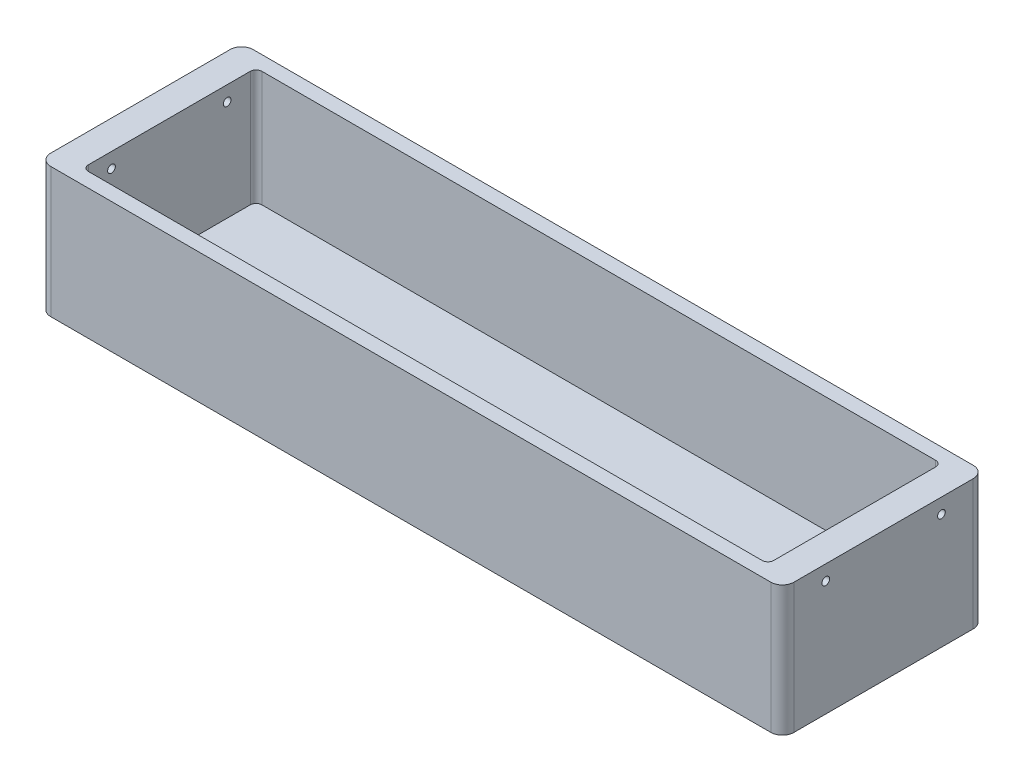
ISO-10303-21;
HEADER;
FILE_DESCRIPTION(('STEP AP214'),'2;1');
FILE_NAME('part.step','',(''),(''),'','','');
FILE_SCHEMA(('AUTOMOTIVE_DESIGN { 1 0 10303 214 1 1 1 1 }'));
ENDSEC;
DATA;
#1=APPLICATION_CONTEXT('core data for automotive mechanical design processes');
#2=APPLICATION_PROTOCOL_DEFINITION('international standard','automotive_design',2000,#1);
#3=PRODUCT_CONTEXT('',#1,'mechanical');
#4=PRODUCT('Part','Part','',(#3));
#5=PRODUCT_RELATED_PRODUCT_CATEGORY('part','',(#4));
#6=PRODUCT_DEFINITION_FORMATION('','',#4);
#7=PRODUCT_DEFINITION_CONTEXT('part definition',#1,'design');
#8=PRODUCT_DEFINITION('design','',#6,#7);
#9=PRODUCT_DEFINITION_SHAPE('','',#8);
#10=(LENGTH_UNIT() NAMED_UNIT(*) SI_UNIT(.MILLI.,.METRE.));
#11=(NAMED_UNIT(*) PLANE_ANGLE_UNIT() SI_UNIT($,.RADIAN.));
#12=(NAMED_UNIT(*) SI_UNIT($,.STERADIAN.) SOLID_ANGLE_UNIT());
#13=UNCERTAINTY_MEASURE_WITH_UNIT(LENGTH_MEASURE(1.E-05),#10,'distance_accuracy_value','');
#14=(GEOMETRIC_REPRESENTATION_CONTEXT(3) GLOBAL_UNCERTAINTY_ASSIGNED_CONTEXT((#13)) GLOBAL_UNIT_ASSIGNED_CONTEXT((#10,
#11,#12)) REPRESENTATION_CONTEXT('',''));
#15=CARTESIAN_POINT('',(0.,0.,0.));
#16=DIRECTION('',(0.,0.,1.));
#17=DIRECTION('',(1.,0.,0.));
#18=AXIS2_PLACEMENT_3D('',#15,#16,#17);
#19=CARTESIAN_POINT('',(0.,50.8,0.));
#20=DIRECTION('',(0.,-1.,0.));
#21=DIRECTION('',(0.,0.,-1.));
#22=AXIS2_PLACEMENT_3D('',#19,#20,#21);
#23=PLANE('',#22);
#24=DIRECTION('',(0.,0.,-1.));
#25=VECTOR('',#24,1.);
#26=CARTESIAN_POINT('',(163.195,50.8,44.45));
#27=LINE('',#26,#25);
#28=CARTESIAN_POINT('',(163.195,50.8,39.37));
#29=VERTEX_POINT('',#28);
#30=CARTESIAN_POINT('',(163.195,50.8,-39.37));
#31=VERTEX_POINT('',#30);
#32=EDGE_CURVE('E317',#29,#31,#27,.T.);
#33=ORIENTED_EDGE('',*,*,#32,.T.);
#34=CARTESIAN_POINT('',(158.115,50.8,-39.37));
#35=DIRECTION('',(0.,-1.,0.));
#36=DIRECTION('',(0.,0.,-1.));
#37=AXIS2_PLACEMENT_3D('',#34,#35,#36);
#38=CIRCLE('',#37,5.08);
#39=CARTESIAN_POINT('',(158.115,50.8,-44.45));
#40=VERTEX_POINT('',#39);
#41=EDGE_CURVE('E223',#31,#40,#38,.F.);
#42=ORIENTED_EDGE('',*,*,#41,.T.);
#43=DIRECTION('',(-1.,0.,0.));
#44=VECTOR('',#43,1.);
#45=CARTESIAN_POINT('',(-163.195,50.8,-44.45));
#46=LINE('',#45,#44);
#47=CARTESIAN_POINT('',(-158.115,50.8,-44.45));
#48=VERTEX_POINT('',#47);
#49=EDGE_CURVE('E325',#40,#48,#46,.T.);
#50=ORIENTED_EDGE('',*,*,#49,.T.);
#51=CARTESIAN_POINT('',(-158.115,50.8,-39.37));
#52=DIRECTION('',(0.,-1.,0.));
#53=DIRECTION('',(0.,0.,-1.));
#54=AXIS2_PLACEMENT_3D('',#51,#52,#53);
#55=CIRCLE('',#54,5.08);
#56=CARTESIAN_POINT('',(-163.195,50.8,-39.37));
#57=VERTEX_POINT('',#56);
#58=EDGE_CURVE('E185',#48,#57,#55,.F.);
#59=ORIENTED_EDGE('',*,*,#58,.T.);
#60=DIRECTION('',(0.,0.,1.));
#61=VECTOR('',#60,1.);
#62=CARTESIAN_POINT('',(-163.195,50.8,44.4500000000001));
#63=LINE('',#62,#61);
#64=CARTESIAN_POINT('',(-163.195,50.8,39.3700000000001));
#65=VERTEX_POINT('',#64);
#66=EDGE_CURVE('E195',#57,#65,#63,.T.);
#67=ORIENTED_EDGE('',*,*,#66,.T.);
#68=CARTESIAN_POINT('',(-158.115,50.8,39.3700000000001));
#69=DIRECTION('',(0.,-1.,0.));
#70=DIRECTION('',(0.,0.,-1.));
#71=AXIS2_PLACEMENT_3D('',#68,#69,#70);
#72=CIRCLE('',#71,5.08);
#73=CARTESIAN_POINT('',(-158.115,50.8,44.4500000000001));
#74=VERTEX_POINT('',#73);
#75=EDGE_CURVE('E215',#65,#74,#72,.F.);
#76=ORIENTED_EDGE('',*,*,#75,.T.);
#77=DIRECTION('',(1.,0.,0.));
#78=VECTOR('',#77,1.);
#79=CARTESIAN_POINT('',(-163.195,50.8,44.4500000000001));
#80=LINE('',#79,#78);
#81=CARTESIAN_POINT('',(158.115,50.8,44.45));
#82=VERTEX_POINT('',#81);
#83=EDGE_CURVE('E187',#74,#82,#80,.T.);
#84=ORIENTED_EDGE('',*,*,#83,.T.);
#85=CARTESIAN_POINT('',(158.115,50.8,39.37));
#86=DIRECTION('',(0.,-1.,0.));
#87=DIRECTION('',(0.,0.,-1.));
#88=AXIS2_PLACEMENT_3D('',#85,#86,#87);
#89=CIRCLE('',#88,5.08);
#90=EDGE_CURVE('E220',#82,#29,#89,.F.);
#91=ORIENTED_EDGE('',*,*,#90,.T.);
#92=EDGE_LOOP('',(#33,#42,#50,#59,#67,#76,#84,#91));
#93=FACE_BOUND('',#92,.T.);
#94=DIRECTION('',(0.,0.,-1.));
#95=VECTOR('',#94,1.);
#96=CARTESIAN_POINT('',(150.495,50.8,38.1));
#97=LINE('',#96,#95);
#98=CARTESIAN_POINT('',(150.495,50.8,35.56));
#99=VERTEX_POINT('',#98);
#100=CARTESIAN_POINT('',(150.495,50.8,-35.5599999999999));
#101=VERTEX_POINT('',#100);
#102=EDGE_CURVE('E334',#99,#101,#97,.T.);
#103=ORIENTED_EDGE('',*,*,#102,.F.);
#104=CARTESIAN_POINT('',(147.955,50.8,35.56));
#105=DIRECTION('',(0.,-1.,0.));
#106=DIRECTION('',(0.,0.,-1.));
#107=AXIS2_PLACEMENT_3D('',#104,#105,#106);
#108=CIRCLE('',#107,2.54);
#109=CARTESIAN_POINT('',(147.955,50.8,38.1));
#110=VERTEX_POINT('',#109);
#111=EDGE_CURVE('E277',#99,#110,#108,.T.);
#112=ORIENTED_EDGE('',*,*,#111,.T.);
#113=DIRECTION('',(1.,0.,0.));
#114=VECTOR('',#113,1.);
#115=CARTESIAN_POINT('',(-150.495,50.8,38.1));
#116=LINE('',#115,#114);
#117=CARTESIAN_POINT('',(-147.955,50.8,38.1));
#118=VERTEX_POINT('',#117);
#119=EDGE_CURVE('E315',#118,#110,#116,.T.);
#120=ORIENTED_EDGE('',*,*,#119,.F.);
#121=CARTESIAN_POINT('',(-147.955,50.8,35.56));
#122=DIRECTION('',(0.,-1.,0.));
#123=DIRECTION('',(0.,0.,-1.));
#124=AXIS2_PLACEMENT_3D('',#121,#122,#123);
#125=CIRCLE('',#124,2.54);
#126=CARTESIAN_POINT('',(-150.495,50.8,35.56));
#127=VERTEX_POINT('',#126);
#128=EDGE_CURVE('E52',#118,#127,#125,.T.);
#129=ORIENTED_EDGE('',*,*,#128,.T.);
#130=DIRECTION('',(0.,0.,1.));
#131=VECTOR('',#130,1.);
#132=CARTESIAN_POINT('',(-150.495,50.8,38.1));
#133=LINE('',#132,#131);
#134=CARTESIAN_POINT('',(-150.495,50.8,-35.5599999999999));
#135=VERTEX_POINT('',#134);
#136=EDGE_CURVE('E318',#135,#127,#133,.T.);
#137=ORIENTED_EDGE('',*,*,#136,.F.);
#138=CARTESIAN_POINT('',(-147.955,50.8,-35.5599999999999));
#139=DIRECTION('',(0.,-1.,0.));
#140=DIRECTION('',(0.,0.,-1.));
#141=AXIS2_PLACEMENT_3D('',#138,#139,#140);
#142=CIRCLE('',#141,2.54);
#143=CARTESIAN_POINT('',(-147.955,50.8,-38.0999999999999));
#144=VERTEX_POINT('',#143);
#145=EDGE_CURVE('E11',#135,#144,#142,.T.);
#146=ORIENTED_EDGE('',*,*,#145,.T.);
#147=DIRECTION('',(-1.,0.,0.));
#148=VECTOR('',#147,1.);
#149=CARTESIAN_POINT('',(-150.495,50.8,-38.0999999999999));
#150=LINE('',#149,#148);
#151=CARTESIAN_POINT('',(147.955,50.8,-38.1));
#152=VERTEX_POINT('',#151);
#153=EDGE_CURVE('E365',#152,#144,#150,.T.);
#154=ORIENTED_EDGE('',*,*,#153,.F.);
#155=CARTESIAN_POINT('',(147.955,50.8,-35.56));
#156=DIRECTION('',(0.,-1.,0.));
#157=DIRECTION('',(0.,0.,-1.));
#158=AXIS2_PLACEMENT_3D('',#155,#156,#157);
#159=CIRCLE('',#158,2.54);
#160=EDGE_CURVE('E280',#152,#101,#159,.T.);
#161=ORIENTED_EDGE('',*,*,#160,.T.);
#162=EDGE_LOOP('',(#103,#112,#120,#129,#137,#146,#154,#161));
#163=FACE_BOUND('',#162,.T.);
#164=ADVANCED_FACE('F43',(#93,#163),#23,.F.);
#165=CARTESIAN_POINT('',(163.195,50.8,44.45));
#166=DIRECTION('',(-1.,0.,0.));
#167=DIRECTION('',(0.,0.,1.));
#168=AXIS2_PLACEMENT_3D('',#165,#166,#167);
#169=PLANE('',#168);
#170=CARTESIAN_POINT('',(163.195,44.22394,-25.4));
#171=DIRECTION('',(1.,0.,0.));
#172=DIRECTION('',(0.,0.,-1.));
#173=AXIS2_PLACEMENT_3D('',#170,#171,#172);
#174=CIRCLE('',#173,1.6875);
#175=CARTESIAN_POINT('',(163.195,44.22394,-27.0875));
#176=VERTEX_POINT('',#175);
#177=EDGE_CURVE('E302',#176,#176,#174,.T.);
#178=ORIENTED_EDGE('',*,*,#177,.F.);
#179=EDGE_LOOP('',(#178));
#180=FACE_BOUND('',#179,.T.);
#181=CARTESIAN_POINT('',(163.195,44.22394,25.4));
#182=DIRECTION('',(1.,0.,0.));
#183=DIRECTION('',(0.,0.,1.));
#184=AXIS2_PLACEMENT_3D('',#181,#182,#183);
#185=CIRCLE('',#184,1.6875);
#186=CARTESIAN_POINT('',(163.195,44.22394,27.0875));
#187=VERTEX_POINT('',#186);
#188=EDGE_CURVE('E294',#187,#187,#185,.T.);
#189=ORIENTED_EDGE('',*,*,#188,.F.);
#190=EDGE_LOOP('',(#189));
#191=FACE_BOUND('',#190,.T.);
#192=DIRECTION('',(0.,0.,1.));
#193=VECTOR('',#192,1.);
#194=CARTESIAN_POINT('',(163.195,-6.35,-44.45));
#195=LINE('',#194,#193);
#196=CARTESIAN_POINT('',(163.195,-6.35,-39.37));
#197=VERTEX_POINT('',#196);
#198=CARTESIAN_POINT('',(163.195,-6.35,39.37));
#199=VERTEX_POINT('',#198);
#200=EDGE_CURVE('E180',#197,#199,#195,.T.);
#201=ORIENTED_EDGE('',*,*,#200,.F.);
#202=DIRECTION('',(0.,-1.,0.));
#203=VECTOR('',#202,1.);
#204=CARTESIAN_POINT('',(163.195,50.8,-39.37));
#205=LINE('',#204,#203);
#206=EDGE_CURVE('E212',#197,#31,#205,.F.);
#207=ORIENTED_EDGE('',*,*,#206,.T.);
#208=ORIENTED_EDGE('',*,*,#32,.F.);
#209=DIRECTION('',(0.,-1.,0.));
#210=VECTOR('',#209,1.);
#211=CARTESIAN_POINT('',(163.195,50.8,39.37));
#212=LINE('',#211,#210);
#213=EDGE_CURVE('E208',#29,#199,#212,.T.);
#214=ORIENTED_EDGE('',*,*,#213,.T.);
#215=EDGE_LOOP('',(#201,#207,#208,#214));
#216=FACE_BOUND('',#215,.T.);
#217=ADVANCED_FACE('F400',(#180,#191,#216),#169,.F.);
#218=CARTESIAN_POINT('',(-163.195,50.8,-44.45));
#219=DIRECTION('',(0.,0.,1.));
#220=DIRECTION('',(1.,0.,0.));
#221=AXIS2_PLACEMENT_3D('',#218,#219,#220);
#222=PLANE('',#221);
#223=ORIENTED_EDGE('',*,*,#49,.F.);
#224=DIRECTION('',(0.,-1.,0.));
#225=VECTOR('',#224,1.);
#226=CARTESIAN_POINT('',(158.115,50.8,-44.45));
#227=LINE('',#226,#225);
#228=CARTESIAN_POINT('',(158.115,-6.35,-44.45));
#229=VERTEX_POINT('',#228);
#230=EDGE_CURVE('E178',#40,#229,#227,.T.);
#231=ORIENTED_EDGE('',*,*,#230,.T.);
#232=DIRECTION('',(1.,0.,0.));
#233=VECTOR('',#232,1.);
#234=CARTESIAN_POINT('',(-163.195,-6.35,-44.45));
#235=LINE('',#234,#233);
#236=CARTESIAN_POINT('',(-158.115,-6.35,-44.45));
#237=VERTEX_POINT('',#236);
#238=EDGE_CURVE('E160',#237,#229,#235,.T.);
#239=ORIENTED_EDGE('',*,*,#238,.F.);
#240=DIRECTION('',(0.,-1.,0.));
#241=VECTOR('',#240,1.);
#242=CARTESIAN_POINT('',(-158.115,50.8,-44.45));
#243=LINE('',#242,#241);
#244=EDGE_CURVE('E175',#237,#48,#243,.F.);
#245=ORIENTED_EDGE('',*,*,#244,.T.);
#246=EDGE_LOOP('',(#223,#231,#239,#245));
#247=FACE_BOUND('',#246,.T.);
#248=ADVANCED_FACE('F174',(#247),#222,.F.);
#249=CARTESIAN_POINT('',(-163.195,50.8,44.4500000000001));
#250=DIRECTION('',(1.,0.,0.));
#251=DIRECTION('',(0.,0.,-1.));
#252=AXIS2_PLACEMENT_3D('',#249,#250,#251);
#253=PLANE('',#252);
#254=CARTESIAN_POINT('',(-163.195,44.22394,-25.4));
#255=DIRECTION('',(1.,0.,0.));
#256=DIRECTION('',(0.,0.,-1.));
#257=AXIS2_PLACEMENT_3D('',#254,#255,#256);
#258=CIRCLE('',#257,1.6875);
#259=CARTESIAN_POINT('',(-163.195,44.22394,-23.7125));
#260=VERTEX_POINT('',#259);
#261=EDGE_CURVE('E291',#260,#260,#258,.T.);
#262=ORIENTED_EDGE('',*,*,#261,.T.);
#263=EDGE_LOOP('',(#262));
#264=FACE_BOUND('',#263,.T.);
#265=CARTESIAN_POINT('',(-163.195,44.22394,25.4));
#266=DIRECTION('',(1.,0.,0.));
#267=DIRECTION('',(0.,0.,1.));
#268=AXIS2_PLACEMENT_3D('',#265,#266,#267);
#269=CIRCLE('',#268,1.6875);
#270=CARTESIAN_POINT('',(-163.195,44.22394,27.0875));
#271=VERTEX_POINT('',#270);
#272=EDGE_CURVE('E322',#271,#271,#269,.T.);
#273=ORIENTED_EDGE('',*,*,#272,.T.);
#274=EDGE_LOOP('',(#273));
#275=FACE_BOUND('',#274,.T.);
#276=ORIENTED_EDGE('',*,*,#66,.F.);
#277=DIRECTION('',(0.,-1.,0.));
#278=VECTOR('',#277,1.);
#279=CARTESIAN_POINT('',(-163.195,50.8,-39.37));
#280=LINE('',#279,#278);
#281=CARTESIAN_POINT('',(-163.195,-6.35,-39.37));
#282=VERTEX_POINT('',#281);
#283=EDGE_CURVE('E236',#57,#282,#280,.T.);
#284=ORIENTED_EDGE('',*,*,#283,.T.);
#285=DIRECTION('',(0.,0.,-1.));
#286=VECTOR('',#285,1.);
#287=CARTESIAN_POINT('',(-163.195,-6.35,44.4500000000001));
#288=LINE('',#287,#286);
#289=CARTESIAN_POINT('',(-163.195,-6.35,39.3700000000001));
#290=VERTEX_POINT('',#289);
#291=EDGE_CURVE('E162',#290,#282,#288,.T.);
#292=ORIENTED_EDGE('',*,*,#291,.F.);
#293=DIRECTION('',(0.,-1.,0.));
#294=VECTOR('',#293,1.);
#295=CARTESIAN_POINT('',(-163.195,50.8,39.3700000000001));
#296=LINE('',#295,#294);
#297=EDGE_CURVE('E233',#290,#65,#296,.F.);
#298=ORIENTED_EDGE('',*,*,#297,.T.);
#299=EDGE_LOOP('',(#276,#284,#292,#298));
#300=FACE_BOUND('',#299,.T.);
#301=ADVANCED_FACE('F411',(#264,#275,#300),#253,.F.);
#302=CARTESIAN_POINT('',(-163.195,50.8,44.4500000000001));
#303=DIRECTION('',(0.,0.,-1.));
#304=DIRECTION('',(-1.,0.,0.));
#305=AXIS2_PLACEMENT_3D('',#302,#303,#304);
#306=PLANE('',#305);
#307=DIRECTION('',(-1.,0.,0.));
#308=VECTOR('',#307,1.);
#309=CARTESIAN_POINT('',(163.195,-6.35,44.45));
#310=LINE('',#309,#308);
#311=CARTESIAN_POINT('',(158.115,-6.35,44.45));
#312=VERTEX_POINT('',#311);
#313=CARTESIAN_POINT('',(-158.115,-6.35,44.4500000000001));
#314=VERTEX_POINT('',#313);
#315=EDGE_CURVE('E313',#312,#314,#310,.T.);
#316=ORIENTED_EDGE('',*,*,#315,.F.);
#317=DIRECTION('',(0.,-1.,0.));
#318=VECTOR('',#317,1.);
#319=CARTESIAN_POINT('',(158.115,50.8,44.45));
#320=LINE('',#319,#318);
#321=EDGE_CURVE('E230',#312,#82,#320,.F.);
#322=ORIENTED_EDGE('',*,*,#321,.T.);
#323=ORIENTED_EDGE('',*,*,#83,.F.);
#324=DIRECTION('',(0.,-1.,0.));
#325=VECTOR('',#324,1.);
#326=CARTESIAN_POINT('',(-158.115,50.8,44.4500000000001));
#327=LINE('',#326,#325);
#328=EDGE_CURVE('E226',#74,#314,#327,.T.);
#329=ORIENTED_EDGE('',*,*,#328,.T.);
#330=EDGE_LOOP('',(#316,#322,#323,#329));
#331=FACE_BOUND('',#330,.T.);
#332=ADVANCED_FACE('F355',(#331),#306,.F.);
#333=CARTESIAN_POINT('',(150.495,50.8,38.1));
#334=DIRECTION('',(-1.,0.,0.));
#335=DIRECTION('',(0.,0.,1.));
#336=AXIS2_PLACEMENT_3D('',#333,#334,#335);
#337=PLANE('',#336);
#338=CARTESIAN_POINT('',(150.495,44.22394,-25.4));
#339=DIRECTION('',(-1.,0.,0.));
#340=DIRECTION('',(0.,0.,1.));
#341=AXIS2_PLACEMENT_3D('',#338,#339,#340);
#342=CIRCLE('',#341,1.6875);
#343=CARTESIAN_POINT('',(150.495,44.22394,-23.7125));
#344=VERTEX_POINT('',#343);
#345=EDGE_CURVE('E304',#344,#344,#342,.F.);
#346=ORIENTED_EDGE('',*,*,#345,.T.);
#347=EDGE_LOOP('',(#346));
#348=FACE_BOUND('',#347,.T.);
#349=CARTESIAN_POINT('',(150.495,44.22394,25.4));
#350=DIRECTION('',(-1.,0.,0.));
#351=DIRECTION('',(0.,0.,1.));
#352=AXIS2_PLACEMENT_3D('',#349,#350,#351);
#353=CIRCLE('',#352,1.6875);
#354=CARTESIAN_POINT('',(150.495,44.22394,27.0875));
#355=VERTEX_POINT('',#354);
#356=EDGE_CURVE('E292',#355,#355,#353,.F.);
#357=ORIENTED_EDGE('',*,*,#356,.T.);
#358=EDGE_LOOP('',(#357));
#359=FACE_BOUND('',#358,.T.);
#360=DIRECTION('',(0.,0.,-1.));
#361=VECTOR('',#360,1.);
#362=CARTESIAN_POINT('',(150.495,0.,38.1));
#363=LINE('',#362,#361);
#364=CARTESIAN_POINT('',(150.495,0.,35.56));
#365=VERTEX_POINT('',#364);
#366=CARTESIAN_POINT('',(150.495,0.,-35.5599999999999));
#367=VERTEX_POINT('',#366);
#368=EDGE_CURVE('E297',#365,#367,#363,.T.);
#369=ORIENTED_EDGE('',*,*,#368,.F.);
#370=DIRECTION('',(0.,-1.,0.));
#371=VECTOR('',#370,1.);
#372=CARTESIAN_POINT('',(150.495,50.8,35.56));
#373=LINE('',#372,#371);
#374=EDGE_CURVE('E262',#365,#99,#373,.F.);
#375=ORIENTED_EDGE('',*,*,#374,.T.);
#376=ORIENTED_EDGE('',*,*,#102,.T.);
#377=DIRECTION('',(0.,-1.,0.));
#378=VECTOR('',#377,1.);
#379=CARTESIAN_POINT('',(150.495,0.,-35.56));
#380=LINE('',#379,#378);
#381=EDGE_CURVE('E258',#101,#367,#380,.T.);
#382=ORIENTED_EDGE('',*,*,#381,.T.);
#383=EDGE_LOOP('',(#369,#375,#376,#382));
#384=FACE_BOUND('',#383,.T.);
#385=ADVANCED_FACE('F386',(#348,#359,#384),#337,.T.);
#386=CARTESIAN_POINT('',(-150.495,50.8,-38.0999999999999));
#387=DIRECTION('',(0.,0.,1.));
#388=DIRECTION('',(1.,0.,0.));
#389=AXIS2_PLACEMENT_3D('',#386,#387,#388);
#390=PLANE('',#389);
#391=DIRECTION('',(-1.,0.,0.));
#392=VECTOR('',#391,1.);
#393=CARTESIAN_POINT('',(-150.495,0.,-38.0999999999999));
#394=LINE('',#393,#392);
#395=CARTESIAN_POINT('',(147.955,0.,-38.1));
#396=VERTEX_POINT('',#395);
#397=CARTESIAN_POINT('',(-147.955,0.,-38.0999999999999));
#398=VERTEX_POINT('',#397);
#399=EDGE_CURVE('E299',#396,#398,#394,.T.);
#400=ORIENTED_EDGE('',*,*,#399,.F.);
#401=DIRECTION('',(0.,-1.,0.));
#402=VECTOR('',#401,1.);
#403=CARTESIAN_POINT('',(147.955,50.8,-38.1));
#404=LINE('',#403,#402);
#405=EDGE_CURVE('E268',#396,#152,#404,.F.);
#406=ORIENTED_EDGE('',*,*,#405,.T.);
#407=ORIENTED_EDGE('',*,*,#153,.T.);
#408=DIRECTION('',(0.,-1.,0.));
#409=VECTOR('',#408,1.);
#410=CARTESIAN_POINT('',(-147.955,0.,-38.0999999999999));
#411=LINE('',#410,#409);
#412=EDGE_CURVE('E265',#144,#398,#411,.T.);
#413=ORIENTED_EDGE('',*,*,#412,.T.);
#414=EDGE_LOOP('',(#400,#406,#407,#413));
#415=FACE_BOUND('',#414,.T.);
#416=ADVANCED_FACE('F395',(#415),#390,.T.);
#417=CARTESIAN_POINT('',(-150.495,50.8,38.1));
#418=DIRECTION('',(1.,0.,0.));
#419=DIRECTION('',(0.,0.,-1.));
#420=AXIS2_PLACEMENT_3D('',#417,#418,#419);
#421=PLANE('',#420);
#422=CARTESIAN_POINT('',(-150.495,44.22394,-25.4));
#423=DIRECTION('',(1.,0.,0.));
#424=DIRECTION('',(0.,0.,-1.));
#425=AXIS2_PLACEMENT_3D('',#422,#423,#424);
#426=CIRCLE('',#425,1.6875);
#427=CARTESIAN_POINT('',(-150.495,44.22394,-23.7125));
#428=VERTEX_POINT('',#427);
#429=EDGE_CURVE('E198',#428,#428,#426,.F.);
#430=ORIENTED_EDGE('',*,*,#429,.T.);
#431=EDGE_LOOP('',(#430));
#432=FACE_BOUND('',#431,.T.);
#433=CARTESIAN_POINT('',(-150.495,44.22394,25.4));
#434=DIRECTION('',(1.,0.,0.));
#435=DIRECTION('',(0.,0.,-1.));
#436=AXIS2_PLACEMENT_3D('',#433,#434,#435);
#437=CIRCLE('',#436,1.6875);
#438=CARTESIAN_POINT('',(-150.495,44.22394,27.0875));
#439=VERTEX_POINT('',#438);
#440=EDGE_CURVE('E288',#439,#439,#437,.F.);
#441=ORIENTED_EDGE('',*,*,#440,.T.);
#442=EDGE_LOOP('',(#441));
#443=FACE_BOUND('',#442,.T.);
#444=ORIENTED_EDGE('',*,*,#136,.T.);
#445=DIRECTION('',(0.,-1.,0.));
#446=VECTOR('',#445,1.);
#447=CARTESIAN_POINT('',(-150.495,0.,35.56));
#448=LINE('',#447,#446);
#449=CARTESIAN_POINT('',(-150.495,0.,35.56));
#450=VERTEX_POINT('',#449);
#451=EDGE_CURVE('E273',#127,#450,#448,.T.);
#452=ORIENTED_EDGE('',*,*,#451,.T.);
#453=DIRECTION('',(0.,0.,1.));
#454=VECTOR('',#453,1.);
#455=CARTESIAN_POINT('',(-150.495,0.,38.1));
#456=LINE('',#455,#454);
#457=CARTESIAN_POINT('',(-150.495,0.,-35.5599999999999));
#458=VERTEX_POINT('',#457);
#459=EDGE_CURVE('E309',#458,#450,#456,.T.);
#460=ORIENTED_EDGE('',*,*,#459,.F.);
#461=DIRECTION('',(0.,-1.,0.));
#462=VECTOR('',#461,1.);
#463=CARTESIAN_POINT('',(-150.495,50.8,-35.5599999999999));
#464=LINE('',#463,#462);
#465=EDGE_CURVE('E65',#458,#135,#464,.F.);
#466=ORIENTED_EDGE('',*,*,#465,.T.);
#467=EDGE_LOOP('',(#444,#452,#460,#466));
#468=FACE_BOUND('',#467,.T.);
#469=ADVANCED_FACE('F370',(#432,#443,#468),#421,.T.);
#470=CARTESIAN_POINT('',(-150.495,50.8,38.1));
#471=DIRECTION('',(0.,0.,-1.));
#472=DIRECTION('',(-1.,0.,0.));
#473=AXIS2_PLACEMENT_3D('',#470,#471,#472);
#474=PLANE('',#473);
#475=ORIENTED_EDGE('',*,*,#119,.T.);
#476=DIRECTION('',(0.,-1.,0.));
#477=VECTOR('',#476,1.);
#478=CARTESIAN_POINT('',(147.955,0.,38.1));
#479=LINE('',#478,#477);
#480=CARTESIAN_POINT('',(147.955,0.,38.1));
#481=VERTEX_POINT('',#480);
#482=EDGE_CURVE('E242',#110,#481,#479,.T.);
#483=ORIENTED_EDGE('',*,*,#482,.T.);
#484=DIRECTION('',(1.,0.,0.));
#485=VECTOR('',#484,1.);
#486=CARTESIAN_POINT('',(-150.495,0.,38.1));
#487=LINE('',#486,#485);
#488=CARTESIAN_POINT('',(-147.955,0.,38.1));
#489=VERTEX_POINT('',#488);
#490=EDGE_CURVE('E329',#489,#481,#487,.T.);
#491=ORIENTED_EDGE('',*,*,#490,.F.);
#492=DIRECTION('',(0.,-1.,0.));
#493=VECTOR('',#492,1.);
#494=CARTESIAN_POINT('',(-147.955,50.8,38.1));
#495=LINE('',#494,#493);
#496=EDGE_CURVE('E239',#489,#118,#495,.F.);
#497=ORIENTED_EDGE('',*,*,#496,.T.);
#498=EDGE_LOOP('',(#475,#483,#491,#497));
#499=FACE_BOUND('',#498,.T.);
#500=ADVANCED_FACE('F378',(#499),#474,.T.);
#501=CARTESIAN_POINT('',(0.,0.,0.));
#502=DIRECTION('',(0.,-1.,0.));
#503=DIRECTION('',(0.,0.,-1.));
#504=AXIS2_PLACEMENT_3D('',#501,#502,#503);
#505=PLANE('',#504);
#506=CARTESIAN_POINT('',(-106.,0.,7.49999999999999));
#507=DIRECTION('',(0.,-1.,0.));
#508=DIRECTION('',(0.,0.,-1.));
#509=AXIS2_PLACEMENT_3D('',#506,#507,#508);
#510=CIRCLE('',#509,3.1);
#511=CARTESIAN_POINT('',(-106.,0.,4.39999999999999));
#512=VERTEX_POINT('',#511);
#513=EDGE_CURVE('E181',#512,#512,#510,.T.);
#514=ORIENTED_EDGE('',*,*,#513,.T.);
#515=EDGE_LOOP('',(#514));
#516=FACE_BOUND('',#515,.T.);
#517=CARTESIAN_POINT('',(-106.,0.,-7.49999999999999));
#518=DIRECTION('',(0.,-1.,0.));
#519=DIRECTION('',(0.,0.,-1.));
#520=AXIS2_PLACEMENT_3D('',#517,#518,#519);
#521=CIRCLE('',#520,3.1);
#522=CARTESIAN_POINT('',(-106.,0.,-10.6));
#523=VERTEX_POINT('',#522);
#524=EDGE_CURVE('E286',#523,#523,#521,.T.);
#525=ORIENTED_EDGE('',*,*,#524,.T.);
#526=EDGE_LOOP('',(#525));
#527=FACE_BOUND('',#526,.T.);
#528=ORIENTED_EDGE('',*,*,#490,.T.);
#529=CARTESIAN_POINT('',(147.955,0.,35.56));
#530=DIRECTION('',(0.,-1.,0.));
#531=DIRECTION('',(0.,0.,-1.));
#532=AXIS2_PLACEMENT_3D('',#529,#530,#531);
#533=CIRCLE('',#532,2.54);
#534=EDGE_CURVE('E255',#481,#365,#533,.F.);
#535=ORIENTED_EDGE('',*,*,#534,.T.);
#536=ORIENTED_EDGE('',*,*,#368,.T.);
#537=CARTESIAN_POINT('',(147.955,0.,-35.56));
#538=DIRECTION('',(0.,-1.,0.));
#539=DIRECTION('',(0.,0.,-1.));
#540=AXIS2_PLACEMENT_3D('',#537,#538,#539);
#541=CIRCLE('',#540,2.54);
#542=EDGE_CURVE('E252',#367,#396,#541,.F.);
#543=ORIENTED_EDGE('',*,*,#542,.T.);
#544=ORIENTED_EDGE('',*,*,#399,.T.);
#545=CARTESIAN_POINT('',(-147.955,0.,-35.5599999999999));
#546=DIRECTION('',(0.,-1.,0.));
#547=DIRECTION('',(0.,0.,-1.));
#548=AXIS2_PLACEMENT_3D('',#545,#546,#547);
#549=CIRCLE('',#548,2.54);
#550=EDGE_CURVE('E246',#398,#458,#549,.F.);
#551=ORIENTED_EDGE('',*,*,#550,.T.);
#552=ORIENTED_EDGE('',*,*,#459,.T.);
#553=CARTESIAN_POINT('',(-147.955,0.,35.56));
#554=DIRECTION('',(0.,-1.,0.));
#555=DIRECTION('',(0.,0.,-1.));
#556=AXIS2_PLACEMENT_3D('',#553,#554,#555);
#557=CIRCLE('',#556,2.54);
#558=EDGE_CURVE('E249',#450,#489,#557,.F.);
#559=ORIENTED_EDGE('',*,*,#558,.T.);
#560=EDGE_LOOP('',(#528,#535,#536,#543,#544,#551,#552,#559));
#561=FACE_BOUND('',#560,.T.);
#562=ADVANCED_FACE('F376',(#516,#527,#561),#505,.F.);
#563=CARTESIAN_POINT('',(0.,-6.35,0.));
#564=DIRECTION('',(0.,-1.,0.));
#565=DIRECTION('',(0.,0.,-1.));
#566=AXIS2_PLACEMENT_3D('',#563,#564,#565);
#567=PLANE('',#566);
#568=CARTESIAN_POINT('',(-106.,-6.35,7.49999999999999));
#569=DIRECTION('',(0.,-1.,0.));
#570=DIRECTION('',(0.,0.,-1.));
#571=AXIS2_PLACEMENT_3D('',#568,#569,#570);
#572=CIRCLE('',#571,3.1);
#573=CARTESIAN_POINT('',(-106.,-6.35,4.39999999999999));
#574=VERTEX_POINT('',#573);
#575=EDGE_CURVE('E666',#574,#574,#572,.T.);
#576=ORIENTED_EDGE('',*,*,#575,.F.);
#577=EDGE_LOOP('',(#576));
#578=FACE_BOUND('',#577,.T.);
#579=CARTESIAN_POINT('',(-106.,-6.35,-7.49999999999999));
#580=DIRECTION('',(0.,-1.,0.));
#581=DIRECTION('',(0.,0.,1.));
#582=AXIS2_PLACEMENT_3D('',#579,#580,#581);
#583=CIRCLE('',#582,3.1);
#584=CARTESIAN_POINT('',(-106.,-6.35,-4.39999999999999));
#585=VERTEX_POINT('',#584);
#586=EDGE_CURVE('E661',#585,#585,#583,.T.);
#587=ORIENTED_EDGE('',*,*,#586,.F.);
#588=EDGE_LOOP('',(#587));
#589=FACE_BOUND('',#588,.T.);
#590=ORIENTED_EDGE('',*,*,#238,.T.);
#591=CARTESIAN_POINT('',(158.115,-6.35,-39.37));
#592=DIRECTION('',(0.,-1.,0.));
#593=DIRECTION('',(0.,0.,-1.));
#594=AXIS2_PLACEMENT_3D('',#591,#592,#593);
#595=CIRCLE('',#594,5.08);
#596=EDGE_CURVE('E205',#229,#197,#595,.T.);
#597=ORIENTED_EDGE('',*,*,#596,.T.);
#598=ORIENTED_EDGE('',*,*,#200,.T.);
#599=CARTESIAN_POINT('',(158.115,-6.35,39.37));
#600=DIRECTION('',(0.,-1.,0.));
#601=DIRECTION('',(0.,0.,-1.));
#602=AXIS2_PLACEMENT_3D('',#599,#600,#601);
#603=CIRCLE('',#602,5.08);
#604=EDGE_CURVE('E168',#199,#312,#603,.T.);
#605=ORIENTED_EDGE('',*,*,#604,.T.);
#606=ORIENTED_EDGE('',*,*,#315,.T.);
#607=CARTESIAN_POINT('',(-158.115,-6.35,39.3700000000001));
#608=DIRECTION('',(0.,-1.,0.));
#609=DIRECTION('',(0.,0.,-1.));
#610=AXIS2_PLACEMENT_3D('',#607,#608,#609);
#611=CIRCLE('',#610,5.08);
#612=EDGE_CURVE('E169',#314,#290,#611,.T.);
#613=ORIENTED_EDGE('',*,*,#612,.T.);
#614=ORIENTED_EDGE('',*,*,#291,.T.);
#615=CARTESIAN_POINT('',(-158.115,-6.35,-39.37));
#616=DIRECTION('',(0.,-1.,0.));
#617=DIRECTION('',(0.,0.,-1.));
#618=AXIS2_PLACEMENT_3D('',#615,#616,#617);
#619=CIRCLE('',#618,5.08);
#620=EDGE_CURVE('E157',#282,#237,#619,.T.);
#621=ORIENTED_EDGE('',*,*,#620,.T.);
#622=EDGE_LOOP('',(#590,#597,#598,#605,#606,#613,#614,#621));
#623=FACE_BOUND('',#622,.T.);
#624=ADVANCED_FACE('F159',(#578,#589,#623),#567,.T.);
#625=CARTESIAN_POINT('',(-106.,50.8,-7.49999999999999));
#626=DIRECTION('',(0.,-1.,0.));
#627=DIRECTION('',(0.,0.,-1.));
#628=AXIS2_PLACEMENT_3D('',#625,#626,#627);
#629=CYLINDRICAL_SURFACE('',#628,3.1);
#630=ORIENTED_EDGE('',*,*,#586,.T.);
#631=EDGE_LOOP('',(#630));
#632=FACE_BOUND('',#631,.T.);
#633=ORIENTED_EDGE('',*,*,#524,.F.);
#634=EDGE_LOOP('',(#633));
#635=FACE_BOUND('',#634,.T.);
#636=ADVANCED_FACE('F540',(#632,#635),#629,.F.);
#637=CARTESIAN_POINT('',(-106.,50.8,7.49999999999999));
#638=DIRECTION('',(0.,-1.,0.));
#639=DIRECTION('',(0.,0.,-1.));
#640=AXIS2_PLACEMENT_3D('',#637,#638,#639);
#641=CYLINDRICAL_SURFACE('',#640,3.1);
#642=ORIENTED_EDGE('',*,*,#575,.T.);
#643=EDGE_LOOP('',(#642));
#644=FACE_BOUND('',#643,.T.);
#645=ORIENTED_EDGE('',*,*,#513,.F.);
#646=EDGE_LOOP('',(#645));
#647=FACE_BOUND('',#646,.T.);
#648=ADVANCED_FACE('F600',(#644,#647),#641,.F.);
#649=CARTESIAN_POINT('',(145.722029226991,44.22394,25.4));
#650=DIRECTION('',(1.,0.,0.));
#651=DIRECTION('',(0.,0.,-1.));
#652=AXIS2_PLACEMENT_3D('',#649,#650,#651);
#653=CYLINDRICAL_SURFACE('',#652,1.6875);
#654=ORIENTED_EDGE('',*,*,#188,.T.);
#655=EDGE_LOOP('',(#654));
#656=FACE_BOUND('',#655,.T.);
#657=ORIENTED_EDGE('',*,*,#356,.F.);
#658=EDGE_LOOP('',(#657));
#659=FACE_BOUND('',#658,.T.);
#660=ADVANCED_FACE('F590',(#656,#659),#653,.F.);
#661=CARTESIAN_POINT('',(145.722029226991,44.22394,-25.4));
#662=DIRECTION('',(1.,0.,0.));
#663=DIRECTION('',(0.,0.,-1.));
#664=AXIS2_PLACEMENT_3D('',#661,#662,#663);
#665=CYLINDRICAL_SURFACE('',#664,1.6875);
#666=ORIENTED_EDGE('',*,*,#177,.T.);
#667=EDGE_LOOP('',(#666));
#668=FACE_BOUND('',#667,.T.);
#669=ORIENTED_EDGE('',*,*,#345,.F.);
#670=EDGE_LOOP('',(#669));
#671=FACE_BOUND('',#670,.T.);
#672=ADVANCED_FACE('F580',(#668,#671),#665,.F.);
#673=CARTESIAN_POINT('',(155.267970773009,44.22394,25.4));
#674=DIRECTION('',(-1.,0.,0.));
#675=DIRECTION('',(0.,0.,1.));
#676=AXIS2_PLACEMENT_3D('',#673,#674,#675);
#677=CYLINDRICAL_SURFACE('',#676,1.6875);
#678=CARTESIAN_POINT('',(-150.495,44.22394,27.0875));
#679=CARTESIAN_POINT('',(-150.627291666667,44.22394,27.0875));
#680=CARTESIAN_POINT('',(-150.759583333333,44.22394,27.0875));
#681=CARTESIAN_POINT('',(-151.024166666667,44.22394,27.0875));
#682=CARTESIAN_POINT('',(-151.156458333333,44.22394,27.0875));
#683=CARTESIAN_POINT('',(-151.421041666667,44.22394,27.0875));
#684=CARTESIAN_POINT('',(-151.553333333333,44.22394,27.0875));
#685=CARTESIAN_POINT('',(-151.817916666667,44.22394,27.0875));
#686=CARTESIAN_POINT('',(-151.950208333333,44.22394,27.0875));
#687=CARTESIAN_POINT('',(-152.214791666667,44.22394,27.0875));
#688=CARTESIAN_POINT('',(-152.347083333333,44.22394,27.0875));
#689=CARTESIAN_POINT('',(-152.611666666667,44.22394,27.0875));
#690=CARTESIAN_POINT('',(-152.743958333333,44.22394,27.0875));
#691=CARTESIAN_POINT('',(-153.008541666667,44.22394,27.0875));
#692=CARTESIAN_POINT('',(-153.140833333333,44.22394,27.0875));
#693=CARTESIAN_POINT('',(-153.405416666667,44.22394,27.0875));
#694=CARTESIAN_POINT('',(-153.537708333333,44.22394,27.0875));
#695=CARTESIAN_POINT('',(-153.802291666667,44.22394,27.0875));
#696=CARTESIAN_POINT('',(-153.934583333333,44.22394,27.0875));
#697=CARTESIAN_POINT('',(-154.199166666667,44.22394,27.0875));
#698=CARTESIAN_POINT('',(-154.331458333333,44.22394,27.0875));
#699=CARTESIAN_POINT('',(-154.596041666667,44.22394,27.0875));
#700=CARTESIAN_POINT('',(-154.728333333333,44.22394,27.0875));
#701=CARTESIAN_POINT('',(-154.992916666667,44.22394,27.0875));
#702=CARTESIAN_POINT('',(-155.125208333333,44.22394,27.0875));
#703=CARTESIAN_POINT('',(-155.389791666667,44.22394,27.0875));
#704=CARTESIAN_POINT('',(-155.522083333333,44.22394,27.0875));
#705=CARTESIAN_POINT('',(-155.786666666667,44.22394,27.0875));
#706=CARTESIAN_POINT('',(-155.918958333333,44.22394,27.0875));
#707=CARTESIAN_POINT('',(-156.183541666667,44.22394,27.0875));
#708=CARTESIAN_POINT('',(-156.315833333333,44.22394,27.0875));
#709=CARTESIAN_POINT('',(-156.580416666667,44.22394,27.0875));
#710=CARTESIAN_POINT('',(-156.712708333333,44.22394,27.0875));
#711=CARTESIAN_POINT('',(-156.977291666667,44.22394,27.0875));
#712=CARTESIAN_POINT('',(-157.109583333333,44.22394,27.0875));
#713=CARTESIAN_POINT('',(-157.374166666667,44.22394,27.0875));
#714=CARTESIAN_POINT('',(-157.506458333333,44.22394,27.0875));
#715=CARTESIAN_POINT('',(-157.771041666667,44.22394,27.0875));
#716=CARTESIAN_POINT('',(-157.903333333333,44.22394,27.0875));
#717=CARTESIAN_POINT('',(-158.167916666667,44.22394,27.0875));
#718=CARTESIAN_POINT('',(-158.300208333333,44.22394,27.0875));
#719=CARTESIAN_POINT('',(-158.564791666667,44.22394,27.0875));
#720=CARTESIAN_POINT('',(-158.697083333333,44.22394,27.0875));
#721=CARTESIAN_POINT('',(-158.961666666667,44.22394,27.0875));
#722=CARTESIAN_POINT('',(-159.093958333333,44.22394,27.0875));
#723=CARTESIAN_POINT('',(-159.358541666667,44.22394,27.0875));
#724=CARTESIAN_POINT('',(-159.490833333333,44.22394,27.0875));
#725=CARTESIAN_POINT('',(-159.755416666667,44.22394,27.0875));
#726=CARTESIAN_POINT('',(-159.887708333333,44.22394,27.0875));
#727=CARTESIAN_POINT('',(-160.152291666667,44.22394,27.0875));
#728=CARTESIAN_POINT('',(-160.284583333333,44.22394,27.0875));
#729=CARTESIAN_POINT('',(-160.549166666667,44.22394,27.0875));
#730=CARTESIAN_POINT('',(-160.681458333333,44.22394,27.0875));
#731=CARTESIAN_POINT('',(-160.946041666667,44.22394,27.0875));
#732=CARTESIAN_POINT('',(-161.078333333333,44.22394,27.0875));
#733=CARTESIAN_POINT('',(-161.342916666667,44.22394,27.0875));
#734=CARTESIAN_POINT('',(-161.475208333333,44.22394,27.0875));
#735=CARTESIAN_POINT('',(-161.739791666667,44.22394,27.0875));
#736=CARTESIAN_POINT('',(-161.872083333333,44.22394,27.0875));
#737=CARTESIAN_POINT('',(-162.136666666667,44.22394,27.0875));
#738=CARTESIAN_POINT('',(-162.268958333333,44.22394,27.0875));
#739=CARTESIAN_POINT('',(-162.533541666667,44.22394,27.0875));
#740=CARTESIAN_POINT('',(-162.665833333333,44.22394,27.0875));
#741=CARTESIAN_POINT('',(-162.930416666667,44.22394,27.0875));
#742=CARTESIAN_POINT('',(-163.062708333333,44.22394,27.0875));
#743=CARTESIAN_POINT('',(-163.195,44.22394,27.0875));
#744=B_SPLINE_CURVE_WITH_KNOTS('',3,(#678,#679,#680,#681,#682,#683,#684,#685,#686,#687,#688,
#689,#690,#691,#692,#693,#694,#695,#696,#697,#698,#699,#700,#701,#702,#703,#704,#705,#706,#707,
#708,#709,#710,#711,#712,#713,#714,#715,#716,#717,#718,#719,#720,#721,#722,#723,#724,#725,#726,
#727,#728,#729,#730,#731,#732,#733,#734,#735,#736,#737,#738,#739,#740,#741,#742,#743),
.UNSPECIFIED.,.F.,.F.,(4,2,2,2,2,2,2,2,2,2,2,2,2,2,2,2,2,2,2,2,2,2,2,2,2,2,2,2,2,2,2,2,4),(0.,
0.396875000000019,0.793749999999982,1.190625,1.58749999999996,1.98437499999998,2.38125,
2.77812499999996,3.17499999999998,3.571875,3.96874999999997,4.36562499999998,4.7625,
5.15937499999997,5.55624999999998,5.95312499999995,6.34999999999997,6.74687499999999,
7.14374999999995,7.54062499999997,7.93749999999993,8.33437499999995,8.73124999999997,
9.12812499999993,9.52499999999995,9.92187499999997,10.3187499999999,10.715625,11.1125,
11.5093749999999,11.90625,12.3031249999999,12.6999999999999),.UNSPECIFIED.);
#745=EDGE_CURVE('BSEAM570',#439,#271,#744,.T.);
#746=ORIENTED_EDGE('',*,*,#440,.F.);
#747=ORIENTED_EDGE('',*,*,#272,.F.);
#748=ORIENTED_EDGE('',*,*,#745,.T.);
#749=ORIENTED_EDGE('',*,*,#745,.F.);
#750=EDGE_LOOP('',(#746,#748,#747,#749));
#751=FACE_BOUND('',#750,.T.);
#752=ADVANCED_FACE('F570',(#751),#677,.F.);
#753=CARTESIAN_POINT('',(155.267970773009,44.22394,-25.4));
#754=DIRECTION('',(-1.,0.,0.));
#755=DIRECTION('',(0.,0.,1.));
#756=AXIS2_PLACEMENT_3D('',#753,#754,#755);
#757=CYLINDRICAL_SURFACE('',#756,1.6875);
#758=CARTESIAN_POINT('',(-150.495,44.22394,-23.7125));
#759=CARTESIAN_POINT('',(-150.627291666667,44.22394,-23.7125));
#760=CARTESIAN_POINT('',(-150.759583333333,44.22394,-23.7125));
#761=CARTESIAN_POINT('',(-151.024166666667,44.22394,-23.7125));
#762=CARTESIAN_POINT('',(-151.156458333333,44.22394,-23.7125));
#763=CARTESIAN_POINT('',(-151.421041666667,44.22394,-23.7125));
#764=CARTESIAN_POINT('',(-151.553333333333,44.22394,-23.7125));
#765=CARTESIAN_POINT('',(-151.817916666667,44.22394,-23.7125));
#766=CARTESIAN_POINT('',(-151.950208333333,44.22394,-23.7125));
#767=CARTESIAN_POINT('',(-152.214791666667,44.22394,-23.7125));
#768=CARTESIAN_POINT('',(-152.347083333333,44.22394,-23.7125));
#769=CARTESIAN_POINT('',(-152.611666666667,44.22394,-23.7125));
#770=CARTESIAN_POINT('',(-152.743958333333,44.22394,-23.7125));
#771=CARTESIAN_POINT('',(-153.008541666667,44.22394,-23.7125));
#772=CARTESIAN_POINT('',(-153.140833333333,44.22394,-23.7125));
#773=CARTESIAN_POINT('',(-153.405416666667,44.22394,-23.7125));
#774=CARTESIAN_POINT('',(-153.537708333333,44.22394,-23.7125));
#775=CARTESIAN_POINT('',(-153.802291666667,44.22394,-23.7125));
#776=CARTESIAN_POINT('',(-153.934583333333,44.22394,-23.7125));
#777=CARTESIAN_POINT('',(-154.199166666667,44.22394,-23.7125));
#778=CARTESIAN_POINT('',(-154.331458333333,44.22394,-23.7125));
#779=CARTESIAN_POINT('',(-154.596041666667,44.22394,-23.7125));
#780=CARTESIAN_POINT('',(-154.728333333333,44.22394,-23.7125));
#781=CARTESIAN_POINT('',(-154.992916666667,44.22394,-23.7125));
#782=CARTESIAN_POINT('',(-155.125208333333,44.22394,-23.7125));
#783=CARTESIAN_POINT('',(-155.389791666667,44.22394,-23.7125));
#784=CARTESIAN_POINT('',(-155.522083333333,44.22394,-23.7125));
#785=CARTESIAN_POINT('',(-155.786666666667,44.22394,-23.7125));
#786=CARTESIAN_POINT('',(-155.918958333333,44.22394,-23.7125));
#787=CARTESIAN_POINT('',(-156.183541666667,44.22394,-23.7125));
#788=CARTESIAN_POINT('',(-156.315833333333,44.22394,-23.7125));
#789=CARTESIAN_POINT('',(-156.580416666667,44.22394,-23.7125));
#790=CARTESIAN_POINT('',(-156.712708333333,44.22394,-23.7125));
#791=CARTESIAN_POINT('',(-156.977291666667,44.22394,-23.7125));
#792=CARTESIAN_POINT('',(-157.109583333333,44.22394,-23.7125));
#793=CARTESIAN_POINT('',(-157.374166666667,44.22394,-23.7125));
#794=CARTESIAN_POINT('',(-157.506458333333,44.22394,-23.7125));
#795=CARTESIAN_POINT('',(-157.771041666667,44.22394,-23.7125));
#796=CARTESIAN_POINT('',(-157.903333333333,44.22394,-23.7125));
#797=CARTESIAN_POINT('',(-158.167916666667,44.22394,-23.7125));
#798=CARTESIAN_POINT('',(-158.300208333333,44.22394,-23.7125));
#799=CARTESIAN_POINT('',(-158.564791666667,44.22394,-23.7125));
#800=CARTESIAN_POINT('',(-158.697083333333,44.22394,-23.7125));
#801=CARTESIAN_POINT('',(-158.961666666667,44.22394,-23.7125));
#802=CARTESIAN_POINT('',(-159.093958333333,44.22394,-23.7125));
#803=CARTESIAN_POINT('',(-159.358541666667,44.22394,-23.7125));
#804=CARTESIAN_POINT('',(-159.490833333333,44.22394,-23.7125));
#805=CARTESIAN_POINT('',(-159.755416666667,44.22394,-23.7125));
#806=CARTESIAN_POINT('',(-159.887708333333,44.22394,-23.7125));
#807=CARTESIAN_POINT('',(-160.152291666667,44.22394,-23.7125));
#808=CARTESIAN_POINT('',(-160.284583333333,44.22394,-23.7125));
#809=CARTESIAN_POINT('',(-160.549166666667,44.22394,-23.7125));
#810=CARTESIAN_POINT('',(-160.681458333333,44.22394,-23.7125));
#811=CARTESIAN_POINT('',(-160.946041666667,44.22394,-23.7125));
#812=CARTESIAN_POINT('',(-161.078333333333,44.22394,-23.7125));
#813=CARTESIAN_POINT('',(-161.342916666667,44.22394,-23.7125));
#814=CARTESIAN_POINT('',(-161.475208333333,44.22394,-23.7125));
#815=CARTESIAN_POINT('',(-161.739791666667,44.22394,-23.7125));
#816=CARTESIAN_POINT('',(-161.872083333333,44.22394,-23.7125));
#817=CARTESIAN_POINT('',(-162.136666666667,44.22394,-23.7125));
#818=CARTESIAN_POINT('',(-162.268958333333,44.22394,-23.7125));
#819=CARTESIAN_POINT('',(-162.533541666667,44.22394,-23.7125));
#820=CARTESIAN_POINT('',(-162.665833333333,44.22394,-23.7125));
#821=CARTESIAN_POINT('',(-162.930416666667,44.22394,-23.7125));
#822=CARTESIAN_POINT('',(-163.062708333333,44.22394,-23.7125));
#823=CARTESIAN_POINT('',(-163.195,44.22394,-23.7125));
#824=B_SPLINE_CURVE_WITH_KNOTS('',3,(#758,#759,#760,#761,#762,#763,#764,#765,#766,#767,#768,
#769,#770,#771,#772,#773,#774,#775,#776,#777,#778,#779,#780,#781,#782,#783,#784,#785,#786,#787,
#788,#789,#790,#791,#792,#793,#794,#795,#796,#797,#798,#799,#800,#801,#802,#803,#804,#805,#806,
#807,#808,#809,#810,#811,#812,#813,#814,#815,#816,#817,#818,#819,#820,#821,#822,#823),
.UNSPECIFIED.,.F.,.F.,(4,2,2,2,2,2,2,2,2,2,2,2,2,2,2,2,2,2,2,2,2,2,2,2,2,2,2,2,2,2,2,2,4),(0.,
0.396875000000019,0.793749999999982,1.190625,1.58749999999996,1.98437499999998,2.38125,
2.77812499999996,3.17499999999998,3.571875,3.96874999999997,4.36562499999998,4.7625,
5.15937499999997,5.55624999999998,5.95312499999995,6.34999999999997,6.74687499999999,
7.14374999999995,7.54062499999997,7.93749999999993,8.33437499999995,8.73124999999997,
9.12812499999993,9.52499999999995,9.92187499999997,10.3187499999999,10.715625,11.1125,
11.5093749999999,11.90625,12.3031249999999,12.6999999999999),.UNSPECIFIED.);
#825=EDGE_CURVE('BSEAM421',#428,#260,#824,.T.);
#826=ORIENTED_EDGE('',*,*,#429,.F.);
#827=ORIENTED_EDGE('',*,*,#261,.F.);
#828=ORIENTED_EDGE('',*,*,#825,.T.);
#829=ORIENTED_EDGE('',*,*,#825,.F.);
#830=EDGE_LOOP('',(#826,#828,#827,#829));
#831=FACE_BOUND('',#830,.T.);
#832=ADVANCED_FACE('F421',(#831),#757,.F.);
#833=CARTESIAN_POINT('',(158.115,50.8,-39.37));
#834=DIRECTION('',(0.,-1.,0.));
#835=DIRECTION('',(0.,0.,-1.));
#836=AXIS2_PLACEMENT_3D('',#833,#834,#835);
#837=CYLINDRICAL_SURFACE('',#836,5.08);
#838=ORIENTED_EDGE('',*,*,#41,.F.);
#839=ORIENTED_EDGE('',*,*,#206,.F.);
#840=ORIENTED_EDGE('',*,*,#596,.F.);
#841=ORIENTED_EDGE('',*,*,#230,.F.);
#842=EDGE_LOOP('',(#838,#839,#840,#841));
#843=FACE_BOUND('',#842,.T.);
#844=ADVANCED_FACE('F417',(#843),#837,.T.);
#845=CARTESIAN_POINT('',(158.115,50.8,39.37));
#846=DIRECTION('',(0.,-1.,0.));
#847=DIRECTION('',(0.,0.,-1.));
#848=AXIS2_PLACEMENT_3D('',#845,#846,#847);
#849=CYLINDRICAL_SURFACE('',#848,5.08);
#850=ORIENTED_EDGE('',*,*,#90,.F.);
#851=ORIENTED_EDGE('',*,*,#321,.F.);
#852=ORIENTED_EDGE('',*,*,#604,.F.);
#853=ORIENTED_EDGE('',*,*,#213,.F.);
#854=EDGE_LOOP('',(#850,#851,#852,#853));
#855=FACE_BOUND('',#854,.T.);
#856=ADVANCED_FACE('F420',(#855),#849,.T.);
#857=CARTESIAN_POINT('',(-158.115,50.8,-39.37));
#858=DIRECTION('',(0.,-1.,0.));
#859=DIRECTION('',(0.,0.,-1.));
#860=AXIS2_PLACEMENT_3D('',#857,#858,#859);
#861=CYLINDRICAL_SURFACE('',#860,5.08);
#862=ORIENTED_EDGE('',*,*,#58,.F.);
#863=ORIENTED_EDGE('',*,*,#244,.F.);
#864=ORIENTED_EDGE('',*,*,#620,.F.);
#865=ORIENTED_EDGE('',*,*,#283,.F.);
#866=EDGE_LOOP('',(#862,#863,#864,#865));
#867=FACE_BOUND('',#866,.T.);
#868=ADVANCED_FACE('F184',(#867),#861,.T.);
#869=CARTESIAN_POINT('',(-158.115,50.8,39.3700000000001));
#870=DIRECTION('',(0.,-1.,0.));
#871=DIRECTION('',(0.,0.,-1.));
#872=AXIS2_PLACEMENT_3D('',#869,#870,#871);
#873=CYLINDRICAL_SURFACE('',#872,5.08);
#874=ORIENTED_EDGE('',*,*,#75,.F.);
#875=ORIENTED_EDGE('',*,*,#297,.F.);
#876=ORIENTED_EDGE('',*,*,#612,.F.);
#877=ORIENTED_EDGE('',*,*,#328,.F.);
#878=EDGE_LOOP('',(#874,#875,#876,#877));
#879=FACE_BOUND('',#878,.T.);
#880=ADVANCED_FACE('F351',(#879),#873,.T.);
#881=CARTESIAN_POINT('',(147.955,50.8,35.56));
#882=DIRECTION('',(0.,1.,0.));
#883=DIRECTION('',(0.,0.,1.));
#884=AXIS2_PLACEMENT_3D('',#881,#882,#883);
#885=CYLINDRICAL_SURFACE('',#884,2.54);
#886=ORIENTED_EDGE('',*,*,#111,.F.);
#887=ORIENTED_EDGE('',*,*,#374,.F.);
#888=ORIENTED_EDGE('',*,*,#534,.F.);
#889=ORIENTED_EDGE('',*,*,#482,.F.);
#890=EDGE_LOOP('',(#886,#887,#888,#889));
#891=FACE_BOUND('',#890,.T.);
#892=ADVANCED_FACE('F382',(#891),#885,.F.);
#893=CARTESIAN_POINT('',(147.955,50.8,-35.56));
#894=DIRECTION('',(0.,1.,0.));
#895=DIRECTION('',(0.,0.,1.));
#896=AXIS2_PLACEMENT_3D('',#893,#894,#895);
#897=CYLINDRICAL_SURFACE('',#896,2.54);
#898=ORIENTED_EDGE('',*,*,#160,.F.);
#899=ORIENTED_EDGE('',*,*,#405,.F.);
#900=ORIENTED_EDGE('',*,*,#542,.F.);
#901=ORIENTED_EDGE('',*,*,#381,.F.);
#902=EDGE_LOOP('',(#898,#899,#900,#901));
#903=FACE_BOUND('',#902,.T.);
#904=ADVANCED_FACE('F391',(#903),#897,.F.);
#905=CARTESIAN_POINT('',(-147.955,50.8,35.56));
#906=DIRECTION('',(0.,1.,0.));
#907=DIRECTION('',(0.,0.,1.));
#908=AXIS2_PLACEMENT_3D('',#905,#906,#907);
#909=CYLINDRICAL_SURFACE('',#908,2.54);
#910=ORIENTED_EDGE('',*,*,#128,.F.);
#911=ORIENTED_EDGE('',*,*,#496,.F.);
#912=ORIENTED_EDGE('',*,*,#558,.F.);
#913=ORIENTED_EDGE('',*,*,#451,.F.);
#914=EDGE_LOOP('',(#910,#911,#912,#913));
#915=FACE_BOUND('',#914,.T.);
#916=ADVANCED_FACE('F373',(#915),#909,.F.);
#917=CARTESIAN_POINT('',(-147.955,50.8,-35.5599999999999));
#918=DIRECTION('',(0.,1.,0.));
#919=DIRECTION('',(0.,0.,1.));
#920=AXIS2_PLACEMENT_3D('',#917,#918,#919);
#921=CYLINDRICAL_SURFACE('',#920,2.54);
#922=ORIENTED_EDGE('',*,*,#145,.F.);
#923=ORIENTED_EDGE('',*,*,#465,.F.);
#924=ORIENTED_EDGE('',*,*,#550,.F.);
#925=ORIENTED_EDGE('',*,*,#412,.F.);
#926=EDGE_LOOP('',(#922,#923,#924,#925));
#927=FACE_BOUND('',#926,.T.);
#928=ADVANCED_FACE('F45',(#927),#921,.F.);
#929=CLOSED_SHELL('',(#164,#217,#248,#301,#332,#385,#416,#469,#500,#562,#624,#636,#648,#660,
#672,#752,#832,#844,#856,#868,#880,#892,#904,#916,#928));
#930=MANIFOLD_SOLID_BREP('B2',#929);
#931=ADVANCED_BREP_SHAPE_REPRESENTATION('',(#18,#930),#14);
#932=SHAPE_DEFINITION_REPRESENTATION(#9,#931);
ENDSEC;
END-ISO-10303-21;
